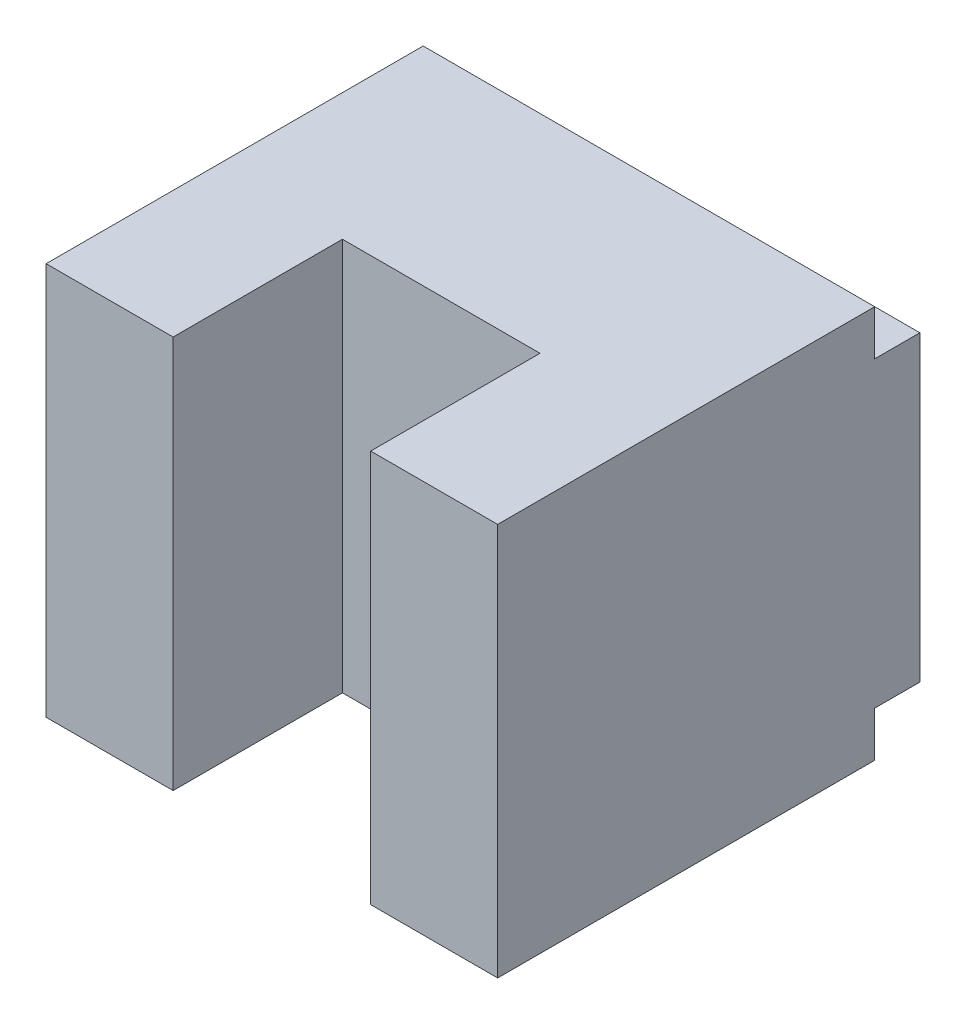
ISO-10303-21;
HEADER;
FILE_DESCRIPTION(('STEP AP214'),'2;1');
FILE_NAME('part.step','',(''),(''),'','','');
FILE_SCHEMA(('AUTOMOTIVE_DESIGN { 1 0 10303 214 1 1 1 1 }'));
ENDSEC;
DATA;
#1=APPLICATION_CONTEXT('core data for automotive mechanical design processes');
#2=APPLICATION_PROTOCOL_DEFINITION('international standard','automotive_design',2000,#1);
#3=PRODUCT_CONTEXT('',#1,'mechanical');
#4=PRODUCT('Part','Part','',(#3));
#5=PRODUCT_RELATED_PRODUCT_CATEGORY('part','',(#4));
#6=PRODUCT_DEFINITION_FORMATION('','',#4);
#7=PRODUCT_DEFINITION_CONTEXT('part definition',#1,'design');
#8=PRODUCT_DEFINITION('design','',#6,#7);
#9=PRODUCT_DEFINITION_SHAPE('','',#8);
#10=(LENGTH_UNIT() NAMED_UNIT(*) SI_UNIT(.MILLI.,.METRE.));
#11=(NAMED_UNIT(*) PLANE_ANGLE_UNIT() SI_UNIT($,.RADIAN.));
#12=(NAMED_UNIT(*) SI_UNIT($,.STERADIAN.) SOLID_ANGLE_UNIT());
#13=UNCERTAINTY_MEASURE_WITH_UNIT(LENGTH_MEASURE(1.E-05),#10,'distance_accuracy_value','');
#14=(GEOMETRIC_REPRESENTATION_CONTEXT(3) GLOBAL_UNCERTAINTY_ASSIGNED_CONTEXT((#13)) GLOBAL_UNIT_ASSIGNED_CONTEXT((#10,
#11,#12)) REPRESENTATION_CONTEXT('',''));
#15=CARTESIAN_POINT('',(0.,0.,0.));
#16=DIRECTION('',(0.,0.,1.));
#17=DIRECTION('',(1.,0.,0.));
#18=AXIS2_PLACEMENT_3D('',#15,#16,#17);
#19=CARTESIAN_POINT('',(0.,0.,23.749));
#20=DIRECTION('',(0.,0.,-1.));
#21=DIRECTION('',(-1.,0.,0.));
#22=AXIS2_PLACEMENT_3D('',#19,#20,#21);
#23=PLANE('',#22);
#24=DIRECTION('',(-1.,0.,0.));
#25=VECTOR('',#24,1.);
#26=CARTESIAN_POINT('',(-12.7,11.049,23.749));
#27=LINE('',#26,#25);
#28=CARTESIAN_POINT('',(12.7,11.049,23.749));
#29=VERTEX_POINT('',#28);
#30=CARTESIAN_POINT('',(5.55625,11.049,23.749));
#31=VERTEX_POINT('',#30);
#32=EDGE_CURVE('E225',#29,#31,#27,.T.);
#33=ORIENTED_EDGE('',*,*,#32,.T.);
#34=DIRECTION('',(0.,1.,0.));
#35=VECTOR('',#34,1.);
#36=CARTESIAN_POINT('',(5.55625,-11.049,23.749));
#37=LINE('',#36,#35);
#38=CARTESIAN_POINT('',(5.55625,-11.049,23.749));
#39=VERTEX_POINT('',#38);
#40=EDGE_CURVE('E211',#39,#31,#37,.T.);
#41=ORIENTED_EDGE('',*,*,#40,.F.);
#42=DIRECTION('',(1.,0.,0.));
#43=VECTOR('',#42,1.);
#44=CARTESIAN_POINT('',(-12.7,-11.049,23.749));
#45=LINE('',#44,#43);
#46=CARTESIAN_POINT('',(12.7,-11.049,23.749));
#47=VERTEX_POINT('',#46);
#48=EDGE_CURVE('E227',#39,#47,#45,.T.);
#49=ORIENTED_EDGE('',*,*,#48,.T.);
#50=DIRECTION('',(0.,1.,0.));
#51=VECTOR('',#50,1.);
#52=CARTESIAN_POINT('',(12.7,-11.049,23.749));
#53=LINE('',#52,#51);
#54=EDGE_CURVE('E159',#47,#29,#53,.T.);
#55=ORIENTED_EDGE('',*,*,#54,.T.);
#56=EDGE_LOOP('',(#33,#41,#49,#55));
#57=FACE_BOUND('',#56,.T.);
#58=ADVANCED_FACE('F43',(#57),#23,.F.);
#59=CARTESIAN_POINT('',(-12.7,-11.049,23.749));
#60=VERTEX_POINT('',#59);
#61=CARTESIAN_POINT('',(-5.55625,-11.049,23.749));
#62=VERTEX_POINT('',#61);
#63=EDGE_CURVE('E164',#60,#62,#45,.T.);
#64=ORIENTED_EDGE('',*,*,#63,.T.);
#65=DIRECTION('',(0.,-1.,0.));
#66=VECTOR('',#65,1.);
#67=CARTESIAN_POINT('',(-5.55625,-11.049,23.749));
#68=LINE('',#67,#66);
#69=CARTESIAN_POINT('',(-5.55625,11.049,23.749));
#70=VERTEX_POINT('',#69);
#71=EDGE_CURVE('E202',#70,#62,#68,.T.);
#72=ORIENTED_EDGE('',*,*,#71,.F.);
#73=CARTESIAN_POINT('',(-12.7,11.049,23.749));
#74=VERTEX_POINT('',#73);
#75=EDGE_CURVE('E186',#70,#74,#27,.T.);
#76=ORIENTED_EDGE('',*,*,#75,.T.);
#77=DIRECTION('',(0.,-1.,0.));
#78=VECTOR('',#77,1.);
#79=CARTESIAN_POINT('',(-12.7,-11.049,23.749));
#80=LINE('',#79,#78);
#81=EDGE_CURVE('E180',#74,#60,#80,.T.);
#82=ORIENTED_EDGE('',*,*,#81,.T.);
#83=EDGE_LOOP('',(#64,#72,#76,#82));
#84=FACE_BOUND('',#83,.T.);
#85=ADVANCED_FACE('F236',(#84),#23,.F.);
#86=CARTESIAN_POINT('',(0.,0.,0.));
#87=DIRECTION('',(0.,0.,-1.));
#88=DIRECTION('',(-1.,0.,0.));
#89=AXIS2_PLACEMENT_3D('',#86,#87,#88);
#90=PLANE('',#89);
#91=DIRECTION('',(1.,0.,0.));
#92=VECTOR('',#91,1.);
#93=CARTESIAN_POINT('',(-12.7,-8.509,0.));
#94=LINE('',#93,#92);
#95=CARTESIAN_POINT('',(-12.7,-8.509,0.));
#96=VERTEX_POINT('',#95);
#97=CARTESIAN_POINT('',(12.7,-8.509,0.));
#98=VERTEX_POINT('',#97);
#99=EDGE_CURVE('E133',#96,#98,#94,.T.);
#100=ORIENTED_EDGE('',*,*,#99,.F.);
#101=DIRECTION('',(0.,-1.,0.));
#102=VECTOR('',#101,1.);
#103=CARTESIAN_POINT('',(-12.7,-11.049,0.));
#104=LINE('',#103,#102);
#105=CARTESIAN_POINT('',(-12.7,8.509,0.));
#106=VERTEX_POINT('',#105);
#107=EDGE_CURVE('E156',#106,#96,#104,.T.);
#108=ORIENTED_EDGE('',*,*,#107,.F.);
#109=DIRECTION('',(1.,0.,0.));
#110=VECTOR('',#109,1.);
#111=CARTESIAN_POINT('',(-12.7,8.509,0.));
#112=LINE('',#111,#110);
#113=CARTESIAN_POINT('',(12.7,8.509,0.));
#114=VERTEX_POINT('',#113);
#115=EDGE_CURVE('E155',#106,#114,#112,.T.);
#116=ORIENTED_EDGE('',*,*,#115,.T.);
#117=DIRECTION('',(0.,1.,0.));
#118=VECTOR('',#117,1.);
#119=CARTESIAN_POINT('',(12.7,-11.049,0.));
#120=LINE('',#119,#118);
#121=EDGE_CURVE('E149',#98,#114,#120,.T.);
#122=ORIENTED_EDGE('',*,*,#121,.F.);
#123=EDGE_LOOP('',(#100,#108,#116,#122));
#124=FACE_BOUND('',#123,.T.);
#125=CARTESIAN_POINT('',(0.,0.,0.));
#126=DIRECTION('',(0.,0.,1.));
#127=DIRECTION('',(1.,0.,0.));
#128=AXIS2_PLACEMENT_3D('',#125,#126,#127);
#129=CIRCLE('',#128,3.175);
#130=CARTESIAN_POINT('',(-3.175,0.,0.));
#131=VERTEX_POINT('',#130);
#132=EDGE_CURVE('E157',#131,#131,#129,.T.);
#133=ORIENTED_EDGE('',*,*,#132,.T.);
#134=EDGE_LOOP('',(#133));
#135=FACE_BOUND('',#134,.T.);
#136=ADVANCED_FACE('F153',(#124,#135),#90,.T.);
#137=CARTESIAN_POINT('',(12.7,-11.049,23.749));
#138=DIRECTION('',(-1.,0.,0.));
#139=DIRECTION('',(0.,0.,1.));
#140=AXIS2_PLACEMENT_3D('',#137,#138,#139);
#141=PLANE('',#140);
#142=DIRECTION('',(0.,0.,-1.));
#143=VECTOR('',#142,1.);
#144=CARTESIAN_POINT('',(12.7,-11.049,23.749));
#145=LINE('',#144,#143);
#146=CARTESIAN_POINT('',(12.7,-11.049,2.54000000000001));
#147=VERTEX_POINT('',#146);
#148=EDGE_CURVE('E167',#47,#147,#145,.T.);
#149=ORIENTED_EDGE('',*,*,#148,.T.);
#150=DIRECTION('',(0.,-1.,0.));
#151=VECTOR('',#150,1.);
#152=CARTESIAN_POINT('',(12.7,-11.049,2.54));
#153=LINE('',#152,#151);
#154=CARTESIAN_POINT('',(12.7,-8.509,2.54));
#155=VERTEX_POINT('',#154);
#156=EDGE_CURVE('E59',#155,#147,#153,.T.);
#157=ORIENTED_EDGE('',*,*,#156,.F.);
#158=DIRECTION('',(0.,0.,1.));
#159=VECTOR('',#158,1.);
#160=CARTESIAN_POINT('',(12.7,-8.509,0.));
#161=LINE('',#160,#159);
#162=EDGE_CURVE('E136',#98,#155,#161,.T.);
#163=ORIENTED_EDGE('',*,*,#162,.F.);
#164=ORIENTED_EDGE('',*,*,#121,.T.);
#165=DIRECTION('',(0.,0.,-1.));
#166=VECTOR('',#165,1.);
#167=CARTESIAN_POINT('',(12.7,8.509,0.));
#168=LINE('',#167,#166);
#169=CARTESIAN_POINT('',(12.7,8.509,2.54));
#170=VERTEX_POINT('',#169);
#171=EDGE_CURVE('E252',#170,#114,#168,.T.);
#172=ORIENTED_EDGE('',*,*,#171,.F.);
#173=DIRECTION('',(0.,-1.,0.));
#174=VECTOR('',#173,1.);
#175=CARTESIAN_POINT('',(12.7,11.049,2.54));
#176=LINE('',#175,#174);
#177=CARTESIAN_POINT('',(12.7,11.049,2.54));
#178=VERTEX_POINT('',#177);
#179=EDGE_CURVE('E251',#178,#170,#176,.T.);
#180=ORIENTED_EDGE('',*,*,#179,.F.);
#181=DIRECTION('',(0.,0.,-1.));
#182=VECTOR('',#181,1.);
#183=CARTESIAN_POINT('',(12.7,11.049,23.749));
#184=LINE('',#183,#182);
#185=EDGE_CURVE('E11',#29,#178,#184,.T.);
#186=ORIENTED_EDGE('',*,*,#185,.F.);
#187=ORIENTED_EDGE('',*,*,#54,.F.);
#188=EDGE_LOOP('',(#149,#157,#163,#164,#172,#180,#186,#187));
#189=FACE_BOUND('',#188,.T.);
#190=ADVANCED_FACE('F45',(#189),#141,.F.);
#191=CARTESIAN_POINT('',(-12.7,11.049,23.749));
#192=DIRECTION('',(0.,-1.,0.));
#193=DIRECTION('',(0.,0.,-1.));
#194=AXIS2_PLACEMENT_3D('',#191,#192,#193);
#195=PLANE('',#194);
#196=ORIENTED_EDGE('',*,*,#185,.T.);
#197=DIRECTION('',(1.,0.,0.));
#198=VECTOR('',#197,1.);
#199=CARTESIAN_POINT('',(-12.7,11.049,2.54));
#200=LINE('',#199,#198);
#201=CARTESIAN_POINT('',(-12.7,11.049,2.54));
#202=VERTEX_POINT('',#201);
#203=EDGE_CURVE('E187',#202,#178,#200,.T.);
#204=ORIENTED_EDGE('',*,*,#203,.F.);
#205=DIRECTION('',(0.,0.,-1.));
#206=VECTOR('',#205,1.);
#207=CARTESIAN_POINT('',(-12.7,11.049,23.749));
#208=LINE('',#207,#206);
#209=EDGE_CURVE('E52',#74,#202,#208,.T.);
#210=ORIENTED_EDGE('',*,*,#209,.F.);
#211=ORIENTED_EDGE('',*,*,#75,.F.);
#212=DIRECTION('',(0.,0.,1.));
#213=VECTOR('',#212,1.);
#214=CARTESIAN_POINT('',(-5.55625,11.049,14.224));
#215=LINE('',#214,#213);
#216=CARTESIAN_POINT('',(-5.55625,11.049,14.224));
#217=VERTEX_POINT('',#216);
#218=EDGE_CURVE('E219',#217,#70,#215,.T.);
#219=ORIENTED_EDGE('',*,*,#218,.F.);
#220=DIRECTION('',(-1.,0.,0.));
#221=VECTOR('',#220,1.);
#222=CARTESIAN_POINT('',(-5.55625,11.049,14.224));
#223=LINE('',#222,#221);
#224=CARTESIAN_POINT('',(5.55625,11.049,14.224));
#225=VERTEX_POINT('',#224);
#226=EDGE_CURVE('E201',#225,#217,#223,.T.);
#227=ORIENTED_EDGE('',*,*,#226,.F.);
#228=DIRECTION('',(0.,0.,1.));
#229=VECTOR('',#228,1.);
#230=CARTESIAN_POINT('',(5.55625,11.049,14.224));
#231=LINE('',#230,#229);
#232=EDGE_CURVE('E210',#225,#31,#231,.T.);
#233=ORIENTED_EDGE('',*,*,#232,.T.);
#234=ORIENTED_EDGE('',*,*,#32,.F.);
#235=EDGE_LOOP('',(#196,#204,#210,#211,#219,#227,#233,#234));
#236=FACE_BOUND('',#235,.T.);
#237=ADVANCED_FACE('F184',(#236),#195,.F.);
#238=CARTESIAN_POINT('',(-12.7,-11.049,23.749));
#239=DIRECTION('',(1.,0.,0.));
#240=DIRECTION('',(0.,0.,-1.));
#241=AXIS2_PLACEMENT_3D('',#238,#239,#240);
#242=PLANE('',#241);
#243=DIRECTION('',(0.,0.,1.));
#244=VECTOR('',#243,1.);
#245=CARTESIAN_POINT('',(-12.7,-8.509,0.));
#246=LINE('',#245,#244);
#247=CARTESIAN_POINT('',(-12.7,-8.509,2.54));
#248=VERTEX_POINT('',#247);
#249=EDGE_CURVE('E138',#96,#248,#246,.T.);
#250=ORIENTED_EDGE('',*,*,#249,.T.);
#251=DIRECTION('',(0.,-1.,0.));
#252=VECTOR('',#251,1.);
#253=CARTESIAN_POINT('',(-12.7,-11.049,2.54));
#254=LINE('',#253,#252);
#255=CARTESIAN_POINT('',(-12.7,-11.049,2.54));
#256=VERTEX_POINT('',#255);
#257=EDGE_CURVE('E144',#248,#256,#254,.T.);
#258=ORIENTED_EDGE('',*,*,#257,.T.);
#259=DIRECTION('',(0.,0.,-1.));
#260=VECTOR('',#259,1.);
#261=CARTESIAN_POINT('',(-12.7,-11.049,23.749));
#262=LINE('',#261,#260);
#263=EDGE_CURVE('E169',#60,#256,#262,.T.);
#264=ORIENTED_EDGE('',*,*,#263,.F.);
#265=ORIENTED_EDGE('',*,*,#81,.F.);
#266=ORIENTED_EDGE('',*,*,#209,.T.);
#267=DIRECTION('',(0.,-1.,0.));
#268=VECTOR('',#267,1.);
#269=CARTESIAN_POINT('',(-12.7,11.049,2.54));
#270=LINE('',#269,#268);
#271=CARTESIAN_POINT('',(-12.7,8.509,2.54));
#272=VERTEX_POINT('',#271);
#273=EDGE_CURVE('E178',#202,#272,#270,.T.);
#274=ORIENTED_EDGE('',*,*,#273,.T.);
#275=DIRECTION('',(0.,0.,-1.));
#276=VECTOR('',#275,1.);
#277=CARTESIAN_POINT('',(-12.7,8.509,0.));
#278=LINE('',#277,#276);
#279=EDGE_CURVE('E67',#272,#106,#278,.T.);
#280=ORIENTED_EDGE('',*,*,#279,.T.);
#281=ORIENTED_EDGE('',*,*,#107,.T.);
#282=EDGE_LOOP('',(#250,#258,#264,#265,#266,#274,#280,#281));
#283=FACE_BOUND('',#282,.T.);
#284=ADVANCED_FACE('F177',(#283),#242,.F.);
#285=CARTESIAN_POINT('',(-12.7,-11.049,23.749));
#286=DIRECTION('',(0.,1.,0.));
#287=DIRECTION('',(0.,0.,1.));
#288=AXIS2_PLACEMENT_3D('',#285,#286,#287);
#289=PLANE('',#288);
#290=ORIENTED_EDGE('',*,*,#263,.T.);
#291=DIRECTION('',(1.,0.,0.));
#292=VECTOR('',#291,1.);
#293=CARTESIAN_POINT('',(-12.7,-11.049,2.54));
#294=LINE('',#293,#292);
#295=EDGE_CURVE('E250',#256,#147,#294,.T.);
#296=ORIENTED_EDGE('',*,*,#295,.T.);
#297=ORIENTED_EDGE('',*,*,#148,.F.);
#298=ORIENTED_EDGE('',*,*,#48,.F.);
#299=DIRECTION('',(0.,0.,1.));
#300=VECTOR('',#299,1.);
#301=CARTESIAN_POINT('',(5.55625,-11.049,14.224));
#302=LINE('',#301,#300);
#303=CARTESIAN_POINT('',(5.55625,-11.049,14.224));
#304=VERTEX_POINT('',#303);
#305=EDGE_CURVE('E214',#304,#39,#302,.T.);
#306=ORIENTED_EDGE('',*,*,#305,.F.);
#307=DIRECTION('',(1.,0.,0.));
#308=VECTOR('',#307,1.);
#309=CARTESIAN_POINT('',(-5.55625,-11.049,14.224));
#310=LINE('',#309,#308);
#311=CARTESIAN_POINT('',(-5.55625,-11.049,14.224));
#312=VERTEX_POINT('',#311);
#313=EDGE_CURVE('E207',#312,#304,#310,.T.);
#314=ORIENTED_EDGE('',*,*,#313,.F.);
#315=DIRECTION('',(0.,0.,1.));
#316=VECTOR('',#315,1.);
#317=CARTESIAN_POINT('',(-5.55625,-11.049,14.224));
#318=LINE('',#317,#316);
#319=EDGE_CURVE('E216',#312,#62,#318,.T.);
#320=ORIENTED_EDGE('',*,*,#319,.T.);
#321=ORIENTED_EDGE('',*,*,#63,.F.);
#322=EDGE_LOOP('',(#290,#296,#297,#298,#306,#314,#320,#321));
#323=FACE_BOUND('',#322,.T.);
#324=ADVANCED_FACE('F238',(#323),#289,.F.);
#325=CARTESIAN_POINT('',(0.,0.,23.749));
#326=DIRECTION('',(0.,0.,-1.));
#327=DIRECTION('',(-1.,0.,0.));
#328=AXIS2_PLACEMENT_3D('',#325,#326,#327);
#329=CYLINDRICAL_SURFACE('',#328,3.175);
#330=CARTESIAN_POINT('',(0.,0.,14.224));
#331=DIRECTION('',(0.,0.,-1.));
#332=DIRECTION('',(-1.,0.,0.));
#333=AXIS2_PLACEMENT_3D('',#330,#331,#332);
#334=CIRCLE('',#333,3.175);
#335=CARTESIAN_POINT('',(-3.175,0.,14.224));
#336=VERTEX_POINT('',#335);
#337=EDGE_CURVE('E47',#336,#336,#334,.T.);
#338=CARTESIAN_POINT('',(-3.175,0.,14.224));
#339=CARTESIAN_POINT('',(-3.175,0.,14.0758333333333));
#340=CARTESIAN_POINT('',(-3.175,0.,13.9276666666667));
#341=CARTESIAN_POINT('',(-3.175,0.,13.6313333333333));
#342=CARTESIAN_POINT('',(-3.175,0.,13.4831666666667));
#343=CARTESIAN_POINT('',(-3.175,0.,13.1868333333333));
#344=CARTESIAN_POINT('',(-3.175,0.,13.0386666666667));
#345=CARTESIAN_POINT('',(-3.175,0.,12.7423333333333));
#346=CARTESIAN_POINT('',(-3.175,0.,12.5941666666667));
#347=CARTESIAN_POINT('',(-3.175,0.,12.2978333333333));
#348=CARTESIAN_POINT('',(-3.175,0.,12.1496666666667));
#349=CARTESIAN_POINT('',(-3.175,0.,11.8533333333333));
#350=CARTESIAN_POINT('',(-3.175,0.,11.7051666666667));
#351=CARTESIAN_POINT('',(-3.175,0.,11.4088333333333));
#352=CARTESIAN_POINT('',(-3.175,0.,11.2606666666667));
#353=CARTESIAN_POINT('',(-3.175,0.,10.9643333333333));
#354=CARTESIAN_POINT('',(-3.175,0.,10.8161666666667));
#355=CARTESIAN_POINT('',(-3.175,0.,10.5198333333333));
#356=CARTESIAN_POINT('',(-3.175,0.,10.3716666666667));
#357=CARTESIAN_POINT('',(-3.175,0.,10.0753333333333));
#358=CARTESIAN_POINT('',(-3.175,0.,9.92716666666666));
#359=CARTESIAN_POINT('',(-3.175,0.,9.63083333333333));
#360=CARTESIAN_POINT('',(-3.175,0.,9.48266666666666));
#361=CARTESIAN_POINT('',(-3.175,0.,9.18633333333333));
#362=CARTESIAN_POINT('',(-3.175,0.,9.03816666666666));
#363=CARTESIAN_POINT('',(-3.175,0.,8.74183333333333));
#364=CARTESIAN_POINT('',(-3.175,0.,8.59366666666666));
#365=CARTESIAN_POINT('',(-3.175,0.,8.29733333333333));
#366=CARTESIAN_POINT('',(-3.175,0.,8.14916666666666));
#367=CARTESIAN_POINT('',(-3.175,0.,7.85283333333333));
#368=CARTESIAN_POINT('',(-3.175,0.,7.70466666666666));
#369=CARTESIAN_POINT('',(-3.175,0.,7.40833333333333));
#370=CARTESIAN_POINT('',(-3.175,0.,7.26016666666666));
#371=CARTESIAN_POINT('',(-3.175,0.,6.96383333333333));
#372=CARTESIAN_POINT('',(-3.175,0.,6.81566666666666));
#373=CARTESIAN_POINT('',(-3.175,0.,6.51933333333333));
#374=CARTESIAN_POINT('',(-3.175,0.,6.37116666666666));
#375=CARTESIAN_POINT('',(-3.175,0.,6.07483333333333));
#376=CARTESIAN_POINT('',(-3.175,0.,5.92666666666666));
#377=CARTESIAN_POINT('',(-3.175,0.,5.63033333333333));
#378=CARTESIAN_POINT('',(-3.175,0.,5.48216666666667));
#379=CARTESIAN_POINT('',(-3.175,0.,5.18583333333333));
#380=CARTESIAN_POINT('',(-3.175,0.,5.03766666666666));
#381=CARTESIAN_POINT('',(-3.175,0.,4.74133333333333));
#382=CARTESIAN_POINT('',(-3.175,0.,4.59316666666667));
#383=CARTESIAN_POINT('',(-3.175,0.,4.29683333333333));
#384=CARTESIAN_POINT('',(-3.175,0.,4.14866666666666));
#385=CARTESIAN_POINT('',(-3.175,0.,3.85233333333333));
#386=CARTESIAN_POINT('',(-3.175,0.,3.70416666666666));
#387=CARTESIAN_POINT('',(-3.175,0.,3.40783333333333));
#388=CARTESIAN_POINT('',(-3.175,0.,3.25966666666667));
#389=CARTESIAN_POINT('',(-3.175,0.,2.96333333333333));
#390=CARTESIAN_POINT('',(-3.175,0.,2.81516666666667));
#391=CARTESIAN_POINT('',(-3.175,0.,2.51883333333333));
#392=CARTESIAN_POINT('',(-3.175,0.,2.37066666666667));
#393=CARTESIAN_POINT('',(-3.175,0.,2.07433333333333));
#394=CARTESIAN_POINT('',(-3.175,0.,1.92616666666667));
#395=CARTESIAN_POINT('',(-3.175,0.,1.62983333333333));
#396=CARTESIAN_POINT('',(-3.175,0.,1.48166666666666));
#397=CARTESIAN_POINT('',(-3.175,0.,1.18533333333333));
#398=CARTESIAN_POINT('',(-3.175,0.,1.03716666666666));
#399=CARTESIAN_POINT('',(-3.175,0.,0.740833333333331));
#400=CARTESIAN_POINT('',(-3.175,0.,0.592666666666664));
#401=CARTESIAN_POINT('',(-3.175,0.,0.29633333333333));
#402=CARTESIAN_POINT('',(-3.175,0.,0.148166666666664));
#403=CARTESIAN_POINT('',(-3.175,0.,0.));
#404=B_SPLINE_CURVE_WITH_KNOTS('',3,(#338,#339,#340,#341,#342,#343,#344,#345,#346,#347,#348,
#349,#350,#351,#352,#353,#354,#355,#356,#357,#358,#359,#360,#361,#362,#363,#364,#365,#366,#367,
#368,#369,#370,#371,#372,#373,#374,#375,#376,#377,#378,#379,#380,#381,#382,#383,#384,#385,#386,
#387,#388,#389,#390,#391,#392,#393,#394,#395,#396,#397,#398,#399,#400,#401,#402,#403),
.UNSPECIFIED.,.F.,.F.,(4,2,2,2,2,2,2,2,2,2,2,2,2,2,2,2,2,2,2,2,2,2,2,2,2,2,2,2,2,2,2,2,4),(0.,
0.4445,0.889000000000001,1.3335,1.778,2.2225,2.667,3.1115,3.556,4.0005,4.445,4.8895,5.334,
5.7785,6.223,6.6675,7.112,7.5565,8.001,8.4455,8.89,9.3345,9.779,10.2235,10.668,11.1125,11.557,
12.0015,12.446,12.8905,13.335,13.7795,14.224),.UNSPECIFIED.);
#405=EDGE_CURVE('BSEAM281',#336,#131,#404,.T.);
#406=ORIENTED_EDGE('',*,*,#337,.F.);
#407=ORIENTED_EDGE('',*,*,#132,.F.);
#408=ORIENTED_EDGE('',*,*,#405,.T.);
#409=ORIENTED_EDGE('',*,*,#405,.F.);
#410=EDGE_LOOP('',(#406,#408,#407,#409));
#411=FACE_BOUND('',#410,.T.);
#412=ADVANCED_FACE('F281',(#411),#329,.F.);
#413=CARTESIAN_POINT('',(5.55625,-11.049,14.224));
#414=DIRECTION('',(1.,0.,0.));
#415=DIRECTION('',(0.,0.,-1.));
#416=AXIS2_PLACEMENT_3D('',#413,#414,#415);
#417=PLANE('',#416);
#418=ORIENTED_EDGE('',*,*,#40,.T.);
#419=ORIENTED_EDGE('',*,*,#232,.F.);
#420=DIRECTION('',(0.,1.,0.));
#421=VECTOR('',#420,1.);
#422=CARTESIAN_POINT('',(5.55625,-11.049,14.224));
#423=LINE('',#422,#421);
#424=EDGE_CURVE('E198',#304,#225,#423,.T.);
#425=ORIENTED_EDGE('',*,*,#424,.F.);
#426=ORIENTED_EDGE('',*,*,#305,.T.);
#427=EDGE_LOOP('',(#418,#419,#425,#426));
#428=FACE_BOUND('',#427,.T.);
#429=ADVANCED_FACE('F248',(#428),#417,.F.);
#430=CARTESIAN_POINT('',(-5.55625,-11.049,14.224));
#431=DIRECTION('',(-1.,0.,0.));
#432=DIRECTION('',(0.,0.,1.));
#433=AXIS2_PLACEMENT_3D('',#430,#431,#432);
#434=PLANE('',#433);
#435=ORIENTED_EDGE('',*,*,#71,.T.);
#436=ORIENTED_EDGE('',*,*,#319,.F.);
#437=DIRECTION('',(0.,-1.,0.));
#438=VECTOR('',#437,1.);
#439=CARTESIAN_POINT('',(-5.55625,-11.049,14.224));
#440=LINE('',#439,#438);
#441=EDGE_CURVE('E205',#217,#312,#440,.T.);
#442=ORIENTED_EDGE('',*,*,#441,.F.);
#443=ORIENTED_EDGE('',*,*,#218,.T.);
#444=EDGE_LOOP('',(#435,#436,#442,#443));
#445=FACE_BOUND('',#444,.T.);
#446=ADVANCED_FACE('F243',(#445),#434,.F.);
#447=CARTESIAN_POINT('',(0.,0.,14.224));
#448=DIRECTION('',(0.,0.,-1.));
#449=DIRECTION('',(-1.,0.,0.));
#450=AXIS2_PLACEMENT_3D('',#447,#448,#449);
#451=PLANE('',#450);
#452=ORIENTED_EDGE('',*,*,#337,.T.);
#453=EDGE_LOOP('',(#452));
#454=FACE_BOUND('',#453,.T.);
#455=ORIENTED_EDGE('',*,*,#424,.T.);
#456=ORIENTED_EDGE('',*,*,#226,.T.);
#457=ORIENTED_EDGE('',*,*,#441,.T.);
#458=ORIENTED_EDGE('',*,*,#313,.T.);
#459=EDGE_LOOP('',(#455,#456,#457,#458));
#460=FACE_BOUND('',#459,.T.);
#461=ADVANCED_FACE('F246',(#454,#460),#451,.F.);
#462=CARTESIAN_POINT('',(-12.7,8.509,0.));
#463=DIRECTION('',(0.,-1.,0.));
#464=DIRECTION('',(0.,0.,-1.));
#465=AXIS2_PLACEMENT_3D('',#462,#463,#464);
#466=PLANE('',#465);
#467=ORIENTED_EDGE('',*,*,#115,.F.);
#468=ORIENTED_EDGE('',*,*,#279,.F.);
#469=DIRECTION('',(1.,0.,0.));
#470=VECTOR('',#469,1.);
#471=CARTESIAN_POINT('',(-12.7,8.509,2.54));
#472=LINE('',#471,#470);
#473=EDGE_CURVE('E192',#272,#170,#472,.T.);
#474=ORIENTED_EDGE('',*,*,#473,.T.);
#475=ORIENTED_EDGE('',*,*,#171,.T.);
#476=EDGE_LOOP('',(#467,#468,#474,#475));
#477=FACE_BOUND('',#476,.T.);
#478=ADVANCED_FACE('F272',(#477),#466,.F.);
#479=CARTESIAN_POINT('',(-12.7,11.049,2.54));
#480=DIRECTION('',(0.,0.,1.));
#481=DIRECTION('',(0.,-1.,0.));
#482=AXIS2_PLACEMENT_3D('',#479,#480,#481);
#483=PLANE('',#482);
#484=ORIENTED_EDGE('',*,*,#473,.F.);
#485=ORIENTED_EDGE('',*,*,#273,.F.);
#486=ORIENTED_EDGE('',*,*,#203,.T.);
#487=ORIENTED_EDGE('',*,*,#179,.T.);
#488=EDGE_LOOP('',(#484,#485,#486,#487));
#489=FACE_BOUND('',#488,.T.);
#490=ADVANCED_FACE('F265',(#489),#483,.F.);
#491=CARTESIAN_POINT('',(-12.7,-11.049,2.54));
#492=DIRECTION('',(0.,0.,1.));
#493=DIRECTION('',(0.,-1.,0.));
#494=AXIS2_PLACEMENT_3D('',#491,#492,#493);
#495=PLANE('',#494);
#496=ORIENTED_EDGE('',*,*,#295,.F.);
#497=ORIENTED_EDGE('',*,*,#257,.F.);
#498=DIRECTION('',(1.,0.,0.));
#499=VECTOR('',#498,1.);
#500=CARTESIAN_POINT('',(-12.7,-8.509,2.54));
#501=LINE('',#500,#499);
#502=EDGE_CURVE('E143',#248,#155,#501,.T.);
#503=ORIENTED_EDGE('',*,*,#502,.T.);
#504=ORIENTED_EDGE('',*,*,#156,.T.);
#505=EDGE_LOOP('',(#496,#497,#503,#504));
#506=FACE_BOUND('',#505,.T.);
#507=ADVANCED_FACE('F263',(#506),#495,.F.);
#508=CARTESIAN_POINT('',(-12.7,-8.509,0.));
#509=DIRECTION('',(0.,1.,0.));
#510=DIRECTION('',(0.,0.,1.));
#511=AXIS2_PLACEMENT_3D('',#508,#509,#510);
#512=PLANE('',#511);
#513=ORIENTED_EDGE('',*,*,#502,.F.);
#514=ORIENTED_EDGE('',*,*,#249,.F.);
#515=ORIENTED_EDGE('',*,*,#99,.T.);
#516=ORIENTED_EDGE('',*,*,#162,.T.);
#517=EDGE_LOOP('',(#513,#514,#515,#516));
#518=FACE_BOUND('',#517,.T.);
#519=ADVANCED_FACE('F135',(#518),#512,.F.);
#520=CLOSED_SHELL('',(#58,#85,#136,#190,#237,#284,#324,#412,#429,#446,#461,#478,#490,#507,#519));
#521=MANIFOLD_SOLID_BREP('B2',#520);
#522=ADVANCED_BREP_SHAPE_REPRESENTATION('',(#18,#521),#14);
#523=SHAPE_DEFINITION_REPRESENTATION(#9,#522);
ENDSEC;
END-ISO-10303-21;
